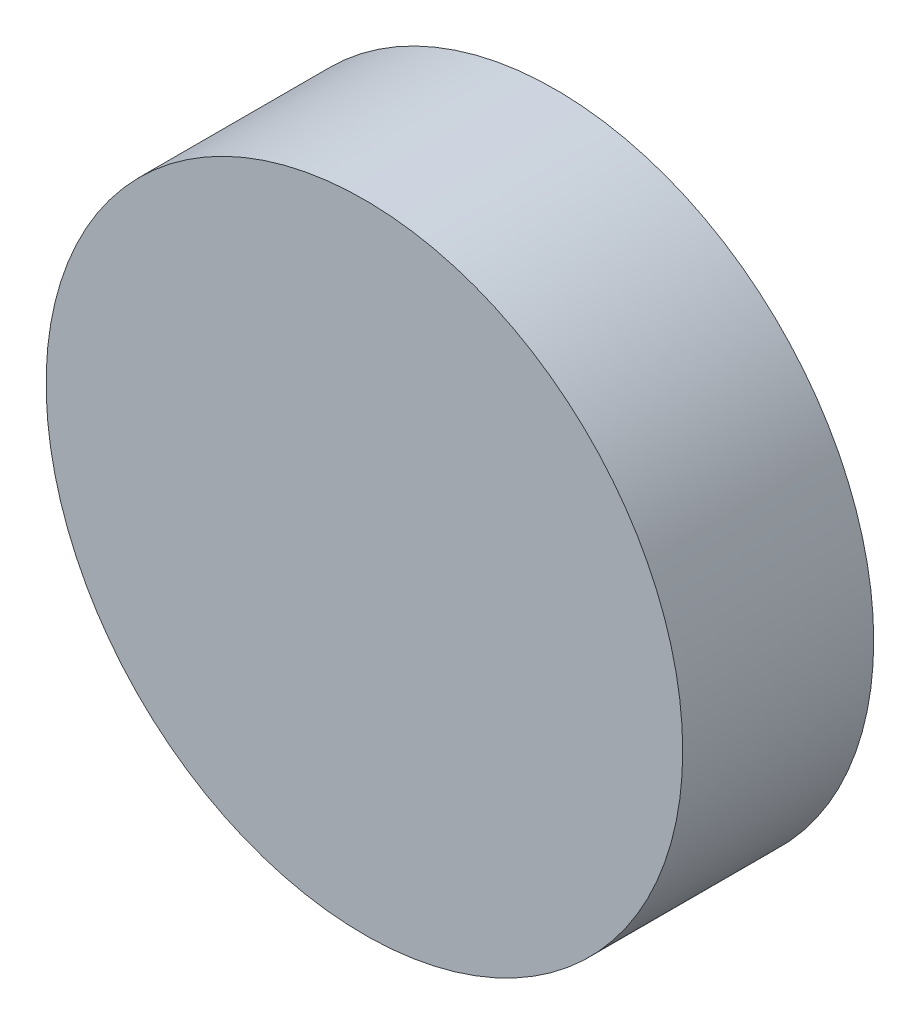
ISO-10303-21;
HEADER;
FILE_DESCRIPTION(('STEP AP214'),'2;1');
FILE_NAME('part.step','',(''),(''),'','','');
FILE_SCHEMA(('AUTOMOTIVE_DESIGN { 1 0 10303 214 1 1 1 1 }'));
ENDSEC;
DATA;
#1=APPLICATION_CONTEXT('core data for automotive mechanical design processes');
#2=APPLICATION_PROTOCOL_DEFINITION('international standard','automotive_design',2000,#1);
#3=PRODUCT_CONTEXT('',#1,'mechanical');
#4=PRODUCT('Part','Part','',(#3));
#5=PRODUCT_RELATED_PRODUCT_CATEGORY('part','',(#4));
#6=PRODUCT_DEFINITION_FORMATION('','',#4);
#7=PRODUCT_DEFINITION_CONTEXT('part definition',#1,'design');
#8=PRODUCT_DEFINITION('design','',#6,#7);
#9=PRODUCT_DEFINITION_SHAPE('','',#8);
#10=(LENGTH_UNIT() NAMED_UNIT(*) SI_UNIT(.MILLI.,.METRE.));
#11=(NAMED_UNIT(*) PLANE_ANGLE_UNIT() SI_UNIT($,.RADIAN.));
#12=(NAMED_UNIT(*) SI_UNIT($,.STERADIAN.) SOLID_ANGLE_UNIT());
#13=UNCERTAINTY_MEASURE_WITH_UNIT(LENGTH_MEASURE(1.E-05),#10,'distance_accuracy_value','');
#14=(GEOMETRIC_REPRESENTATION_CONTEXT(3) GLOBAL_UNCERTAINTY_ASSIGNED_CONTEXT((#13)) GLOBAL_UNIT_ASSIGNED_CONTEXT((#10,
#11,#12)) REPRESENTATION_CONTEXT('',''));
#15=CARTESIAN_POINT('',(0.,0.,0.));
#16=DIRECTION('',(0.,0.,1.));
#17=DIRECTION('',(1.,0.,0.));
#18=AXIS2_PLACEMENT_3D('',#15,#16,#17);
#19=CARTESIAN_POINT('',(0.,0.,7.5));
#20=DIRECTION('',(0.,0.,-1.));
#21=DIRECTION('',(-1.,0.,0.));
#22=AXIS2_PLACEMENT_3D('',#19,#20,#21);
#23=CYLINDRICAL_SURFACE('',#22,25.);
#24=CARTESIAN_POINT('',(0.,0.,7.5));
#25=DIRECTION('',(0.,0.,1.));
#26=DIRECTION('',(1.,0.,0.));
#27=AXIS2_PLACEMENT_3D('',#24,#25,#26);
#28=CIRCLE('',#27,25.);
#29=CARTESIAN_POINT('',(25.,0.,7.5));
#30=VERTEX_POINT('',#29);
#31=EDGE_CURVE('E10',#30,#30,#28,.T.);
#32=ORIENTED_EDGE('',*,*,#31,.F.);
#33=EDGE_LOOP('',(#32));
#34=FACE_BOUND('',#33,.T.);
#35=CARTESIAN_POINT('',(0.,0.,-7.5));
#36=DIRECTION('',(0.,0.,1.));
#37=DIRECTION('',(1.,0.,0.));
#38=AXIS2_PLACEMENT_3D('',#35,#36,#37);
#39=CIRCLE('',#38,25.);
#40=CARTESIAN_POINT('',(25.,0.,-7.5));
#41=VERTEX_POINT('',#40);
#42=EDGE_CURVE('E40',#41,#41,#39,.T.);
#43=ORIENTED_EDGE('',*,*,#42,.T.);
#44=EDGE_LOOP('',(#43));
#45=FACE_BOUND('',#44,.T.);
#46=ADVANCED_FACE('F37',(#34,#45),#23,.T.);
#47=CARTESIAN_POINT('',(0.,0.,7.5));
#48=DIRECTION('',(0.,0.,1.));
#49=DIRECTION('',(1.,0.,0.));
#50=AXIS2_PLACEMENT_3D('',#47,#48,#49);
#51=PLANE('',#50);
#52=ORIENTED_EDGE('',*,*,#31,.T.);
#53=EDGE_LOOP('',(#52));
#54=FACE_BOUND('',#53,.T.);
#55=ADVANCED_FACE('F54',(#54),#51,.T.);
#56=CARTESIAN_POINT('',(0.,0.,-7.5));
#57=DIRECTION('',(0.,0.,1.));
#58=DIRECTION('',(1.,0.,0.));
#59=AXIS2_PLACEMENT_3D('',#56,#57,#58);
#60=PLANE('',#59);
#61=ORIENTED_EDGE('',*,*,#42,.F.);
#62=EDGE_LOOP('',(#61));
#63=FACE_BOUND('',#62,.T.);
#64=ADVANCED_FACE('F52',(#63),#60,.F.);
#65=CLOSED_SHELL('',(#46,#55,#64));
#66=MANIFOLD_SOLID_BREP('B2',#65);
#67=ADVANCED_BREP_SHAPE_REPRESENTATION('',(#18,#66),#14);
#68=SHAPE_DEFINITION_REPRESENTATION(#9,#67);
ENDSEC;
END-ISO-10303-21;
